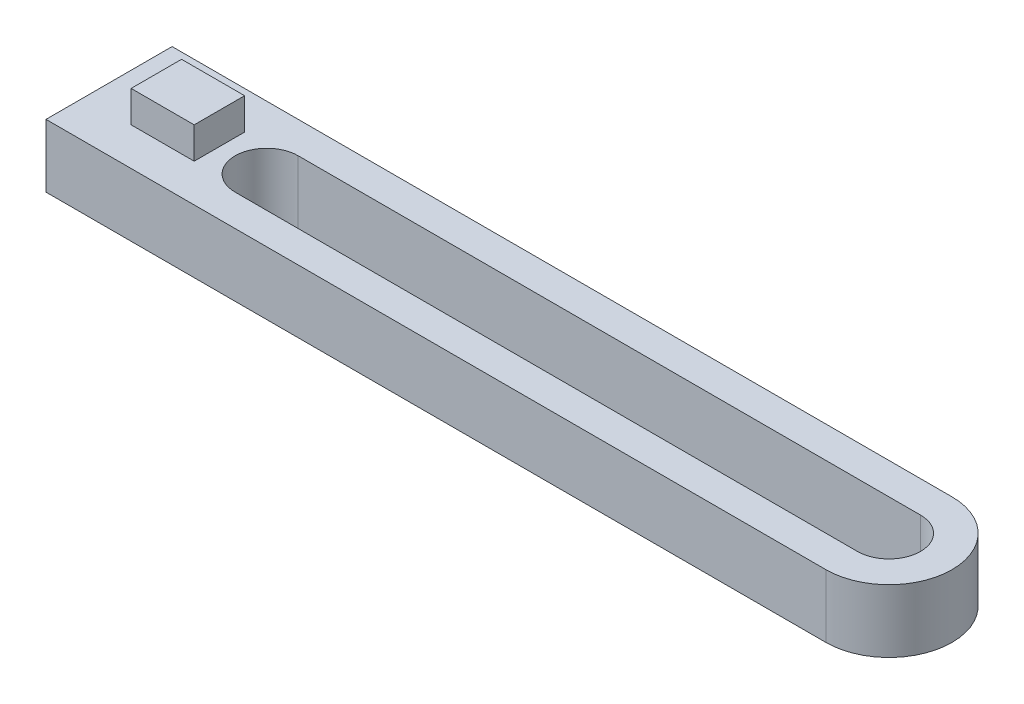
ISO-10303-21;
HEADER;
FILE_DESCRIPTION(('STEP AP214'),'2;1');
FILE_NAME('part.step','',(''),(''),'','','');
FILE_SCHEMA(('AUTOMOTIVE_DESIGN { 1 0 10303 214 1 1 1 1 }'));
ENDSEC;
DATA;
#1=APPLICATION_CONTEXT('core data for automotive mechanical design processes');
#2=APPLICATION_PROTOCOL_DEFINITION('international standard','automotive_design',2000,#1);
#3=PRODUCT_CONTEXT('',#1,'mechanical');
#4=PRODUCT('Part','Part','',(#3));
#5=PRODUCT_RELATED_PRODUCT_CATEGORY('part','',(#4));
#6=PRODUCT_DEFINITION_FORMATION('','',#4);
#7=PRODUCT_DEFINITION_CONTEXT('part definition',#1,'design');
#8=PRODUCT_DEFINITION('design','',#6,#7);
#9=PRODUCT_DEFINITION_SHAPE('','',#8);
#10=(LENGTH_UNIT() NAMED_UNIT(*) SI_UNIT(.MILLI.,.METRE.));
#11=(NAMED_UNIT(*) PLANE_ANGLE_UNIT() SI_UNIT($,.RADIAN.));
#12=(NAMED_UNIT(*) SI_UNIT($,.STERADIAN.) SOLID_ANGLE_UNIT());
#13=UNCERTAINTY_MEASURE_WITH_UNIT(LENGTH_MEASURE(1.E-05),#10,'distance_accuracy_value','');
#14=(GEOMETRIC_REPRESENTATION_CONTEXT(3) GLOBAL_UNCERTAINTY_ASSIGNED_CONTEXT((#13)) GLOBAL_UNIT_ASSIGNED_CONTEXT((#10,
#11,#12)) REPRESENTATION_CONTEXT('',''));
#15=CARTESIAN_POINT('',(0.,0.,0.));
#16=DIRECTION('',(0.,0.,1.));
#17=DIRECTION('',(1.,0.,0.));
#18=AXIS2_PLACEMENT_3D('',#15,#16,#17);
#19=CARTESIAN_POINT('',(0.,0.,0.));
#20=DIRECTION('',(0.,1.,0.));
#21=DIRECTION('',(0.,0.,1.));
#22=AXIS2_PLACEMENT_3D('',#19,#20,#21);
#23=PLANE('',#22);
#24=CARTESIAN_POINT('',(0.,0.,-56.3815572471546));
#25=DIRECTION('',(0.,1.,0.));
#26=DIRECTION('',(0.,0.,1.));
#27=AXIS2_PLACEMENT_3D('',#24,#25,#26);
#28=CIRCLE('',#27,2.);
#29=CARTESIAN_POINT('',(0.,0.,-54.3815572471546));
#30=VERTEX_POINT('',#29);
#31=CARTESIAN_POINT('',(0.,0.,-58.3815572471546));
#32=VERTEX_POINT('',#31);
#33=EDGE_CURVE('E147',#30,#32,#28,.T.);
#34=ORIENTED_EDGE('',*,*,#33,.F.);
#35=DIRECTION('',(1.,0.,0.));
#36=VECTOR('',#35,1.);
#37=CARTESIAN_POINT('',(0.,0.,-54.3815572471546));
#38=LINE('',#37,#36);
#39=CARTESIAN_POINT('',(-39.4787914004602,0.,-54.3815572471546));
#40=VERTEX_POINT('',#39);
#41=EDGE_CURVE('E150',#40,#30,#38,.T.);
#42=ORIENTED_EDGE('',*,*,#41,.F.);
#43=CARTESIAN_POINT('',(-39.4787914004602,0.,-56.3815572471546));
#44=DIRECTION('',(0.,1.,0.));
#45=DIRECTION('',(0.,0.,1.));
#46=AXIS2_PLACEMENT_3D('',#43,#44,#45);
#47=CIRCLE('',#46,2.);
#48=CARTESIAN_POINT('',(-39.4787914004602,0.,-58.3815572471546));
#49=VERTEX_POINT('',#48);
#50=EDGE_CURVE('E179',#40,#49,#47,.F.);
#51=ORIENTED_EDGE('',*,*,#50,.T.);
#52=DIRECTION('',(1.,0.,0.));
#53=VECTOR('',#52,1.);
#54=CARTESIAN_POINT('',(0.,0.,-58.3815572471546));
#55=LINE('',#54,#53);
#56=EDGE_CURVE('E182',#49,#32,#55,.T.);
#57=ORIENTED_EDGE('',*,*,#56,.T.);
#58=EDGE_LOOP('',(#34,#42,#51,#57));
#59=FACE_BOUND('',#58,.T.);
#60=DIRECTION('',(1.,0.,0.));
#61=VECTOR('',#60,1.);
#62=CARTESIAN_POINT('',(0.,0.,-52.3815572471546));
#63=LINE('',#62,#61);
#64=CARTESIAN_POINT('',(-49.4787914004602,0.,-52.3815572471546));
#65=VERTEX_POINT('',#64);
#66=CARTESIAN_POINT('',(0.,0.,-52.3815572471546));
#67=VERTEX_POINT('',#66);
#68=EDGE_CURVE('E185',#65,#67,#63,.T.);
#69=ORIENTED_EDGE('',*,*,#68,.T.);
#70=CARTESIAN_POINT('',(0.,0.,-56.3815572471546));
#71=DIRECTION('',(0.,1.,0.));
#72=DIRECTION('',(0.,0.,1.));
#73=AXIS2_PLACEMENT_3D('',#70,#71,#72);
#74=CIRCLE('',#73,4.);
#75=CARTESIAN_POINT('',(0.,0.,-60.3815572471546));
#76=VERTEX_POINT('',#75);
#77=EDGE_CURVE('E188',#67,#76,#74,.T.);
#78=ORIENTED_EDGE('',*,*,#77,.T.);
#79=DIRECTION('',(1.,0.,0.));
#80=VECTOR('',#79,1.);
#81=CARTESIAN_POINT('',(0.,0.,-60.3815572471546));
#82=LINE('',#81,#80);
#83=CARTESIAN_POINT('',(-49.4787914004602,0.,-60.3815572471546));
#84=VERTEX_POINT('',#83);
#85=EDGE_CURVE('E191',#84,#76,#82,.T.);
#86=ORIENTED_EDGE('',*,*,#85,.F.);
#87=DIRECTION('',(0.,0.,1.));
#88=VECTOR('',#87,1.);
#89=CARTESIAN_POINT('',(-49.4787914004602,0.,0.));
#90=LINE('',#89,#88);
#91=EDGE_CURVE('E159',#84,#65,#90,.T.);
#92=ORIENTED_EDGE('',*,*,#91,.T.);
#93=EDGE_LOOP('',(#69,#78,#86,#92));
#94=FACE_BOUND('',#93,.T.);
#95=DIRECTION('',(0.,0.,-1.));
#96=VECTOR('',#95,1.);
#97=CARTESIAN_POINT('',(-42.4787914004602,0.,0.));
#98=LINE('',#97,#96);
#99=CARTESIAN_POINT('',(-42.4787914004602,0.,-54.7815572471546));
#100=VERTEX_POINT('',#99);
#101=CARTESIAN_POINT('',(-42.4787914004602,0.,-57.9815572471546));
#102=VERTEX_POINT('',#101);
#103=EDGE_CURVE('E52',#100,#102,#98,.T.);
#104=ORIENTED_EDGE('',*,*,#103,.F.);
#105=DIRECTION('',(1.,0.,0.));
#106=VECTOR('',#105,1.);
#107=CARTESIAN_POINT('',(0.,0.,-54.7815572471547));
#108=LINE('',#107,#106);
#109=CARTESIAN_POINT('',(-46.4787914004602,0.,-54.7815572471546));
#110=VERTEX_POINT('',#109);
#111=EDGE_CURVE('E146',#110,#100,#108,.T.);
#112=ORIENTED_EDGE('',*,*,#111,.F.);
#113=DIRECTION('',(0.,0.,-1.));
#114=VECTOR('',#113,1.);
#115=CARTESIAN_POINT('',(-46.4787914004604,0.,-1.00784813221759E-13));
#116=LINE('',#115,#114);
#117=CARTESIAN_POINT('',(-46.4787914004602,0.,-57.9815572471546));
#118=VERTEX_POINT('',#117);
#119=EDGE_CURVE('E143',#110,#118,#116,.T.);
#120=ORIENTED_EDGE('',*,*,#119,.T.);
#121=DIRECTION('',(1.,0.,0.));
#122=VECTOR('',#121,1.);
#123=CARTESIAN_POINT('',(0.,0.,-57.9815572471546));
#124=LINE('',#123,#122);
#125=EDGE_CURVE('E57',#118,#102,#124,.T.);
#126=ORIENTED_EDGE('',*,*,#125,.T.);
#127=EDGE_LOOP('',(#104,#112,#120,#126));
#128=FACE_BOUND('',#127,.T.);
#129=ADVANCED_FACE('F35',(#59,#94,#128),#23,.T.);
#130=CARTESIAN_POINT('',(0.,-4.,-52.3815572471546));
#131=DIRECTION('',(0.,0.,1.));
#132=DIRECTION('',(1.,0.,0.));
#133=AXIS2_PLACEMENT_3D('',#130,#131,#132);
#134=PLANE('',#133);
#135=ORIENTED_EDGE('',*,*,#68,.F.);
#136=DIRECTION('',(0.,1.,0.));
#137=VECTOR('',#136,1.);
#138=CARTESIAN_POINT('',(-49.4787914004602,-4.,-52.3815572471546));
#139=LINE('',#138,#137);
#140=CARTESIAN_POINT('',(-49.4787914004602,-4.,-52.3815572471546));
#141=VERTEX_POINT('',#140);
#142=EDGE_CURVE('E11',#141,#65,#139,.T.);
#143=ORIENTED_EDGE('',*,*,#142,.F.);
#144=DIRECTION('',(1.,0.,0.));
#145=VECTOR('',#144,1.);
#146=CARTESIAN_POINT('',(0.,-4.,-52.3815572471546));
#147=LINE('',#146,#145);
#148=CARTESIAN_POINT('',(0.,-4.,-52.3815572471546));
#149=VERTEX_POINT('',#148);
#150=EDGE_CURVE('E167',#141,#149,#147,.T.);
#151=ORIENTED_EDGE('',*,*,#150,.T.);
#152=DIRECTION('',(0.,1.,0.));
#153=VECTOR('',#152,1.);
#154=CARTESIAN_POINT('',(0.,-4.,-52.3815572471546));
#155=LINE('',#154,#153);
#156=EDGE_CURVE('E199',#149,#67,#155,.T.);
#157=ORIENTED_EDGE('',*,*,#156,.T.);
#158=EDGE_LOOP('',(#135,#143,#151,#157));
#159=FACE_BOUND('',#158,.T.);
#160=ADVANCED_FACE('F238',(#159),#134,.T.);
#161=CARTESIAN_POINT('',(-49.4787914004602,-4.,0.));
#162=DIRECTION('',(-1.,0.,0.));
#163=DIRECTION('',(0.,0.,1.));
#164=AXIS2_PLACEMENT_3D('',#161,#162,#163);
#165=PLANE('',#164);
#166=ORIENTED_EDGE('',*,*,#91,.F.);
#167=DIRECTION('',(0.,1.,0.));
#168=VECTOR('',#167,1.);
#169=CARTESIAN_POINT('',(-49.4787914004602,-4.,-60.3815572471546));
#170=LINE('',#169,#168);
#171=CARTESIAN_POINT('',(-49.4787914004602,-4.,-60.3815572471546));
#172=VERTEX_POINT('',#171);
#173=EDGE_CURVE('E44',#172,#84,#170,.T.);
#174=ORIENTED_EDGE('',*,*,#173,.F.);
#175=DIRECTION('',(0.,0.,1.));
#176=VECTOR('',#175,1.);
#177=CARTESIAN_POINT('',(-49.4787914004602,-4.,0.));
#178=LINE('',#177,#176);
#179=EDGE_CURVE('E175',#172,#141,#178,.T.);
#180=ORIENTED_EDGE('',*,*,#179,.T.);
#181=ORIENTED_EDGE('',*,*,#142,.T.);
#182=EDGE_LOOP('',(#166,#174,#180,#181));
#183=FACE_BOUND('',#182,.T.);
#184=ADVANCED_FACE('F243',(#183),#165,.T.);
#185=CARTESIAN_POINT('',(0.,-4.,-60.3815572471546));
#186=DIRECTION('',(0.,0.,1.));
#187=DIRECTION('',(1.,0.,0.));
#188=AXIS2_PLACEMENT_3D('',#185,#186,#187);
#189=PLANE('',#188);
#190=ORIENTED_EDGE('',*,*,#85,.T.);
#191=DIRECTION('',(0.,1.,0.));
#192=VECTOR('',#191,1.);
#193=CARTESIAN_POINT('',(0.,-4.,-60.3815572471546));
#194=LINE('',#193,#192);
#195=CARTESIAN_POINT('',(0.,-4.,-60.3815572471546));
#196=VERTEX_POINT('',#195);
#197=EDGE_CURVE('E197',#196,#76,#194,.T.);
#198=ORIENTED_EDGE('',*,*,#197,.F.);
#199=DIRECTION('',(1.,0.,0.));
#200=VECTOR('',#199,1.);
#201=CARTESIAN_POINT('',(0.,-4.,-60.3815572471546));
#202=LINE('',#201,#200);
#203=EDGE_CURVE('E173',#172,#196,#202,.T.);
#204=ORIENTED_EDGE('',*,*,#203,.F.);
#205=ORIENTED_EDGE('',*,*,#173,.T.);
#206=EDGE_LOOP('',(#190,#198,#204,#205));
#207=FACE_BOUND('',#206,.T.);
#208=ADVANCED_FACE('F251',(#207),#189,.F.);
#209=CARTESIAN_POINT('',(0.,-4.,-56.3815572471546));
#210=DIRECTION('',(0.,1.,0.));
#211=DIRECTION('',(0.,0.,1.));
#212=AXIS2_PLACEMENT_3D('',#209,#210,#211);
#213=CYLINDRICAL_SURFACE('',#212,2.);
#214=ORIENTED_EDGE('',*,*,#33,.T.);
#215=DIRECTION('',(0.,1.,0.));
#216=VECTOR('',#215,1.);
#217=CARTESIAN_POINT('',(0.,-4.,-58.3815572471546));
#218=LINE('',#217,#216);
#219=CARTESIAN_POINT('',(0.,-4.,-58.3815572471546));
#220=VERTEX_POINT('',#219);
#221=EDGE_CURVE('E201',#220,#32,#218,.T.);
#222=ORIENTED_EDGE('',*,*,#221,.F.);
#223=CARTESIAN_POINT('',(0.,-4.,-56.3815572471546));
#224=DIRECTION('',(0.,1.,0.));
#225=DIRECTION('',(0.,0.,1.));
#226=AXIS2_PLACEMENT_3D('',#223,#224,#225);
#227=CIRCLE('',#226,2.);
#228=CARTESIAN_POINT('',(0.,-4.,-54.3815572471546));
#229=VERTEX_POINT('',#228);
#230=EDGE_CURVE('E156',#229,#220,#227,.T.);
#231=ORIENTED_EDGE('',*,*,#230,.F.);
#232=DIRECTION('',(0.,1.,0.));
#233=VECTOR('',#232,1.);
#234=CARTESIAN_POINT('',(0.,-4.,-54.3815572471546));
#235=LINE('',#234,#233);
#236=EDGE_CURVE('E39',#229,#30,#235,.T.);
#237=ORIENTED_EDGE('',*,*,#236,.T.);
#238=EDGE_LOOP('',(#214,#222,#231,#237));
#239=FACE_BOUND('',#238,.T.);
#240=ADVANCED_FACE('F37',(#239),#213,.F.);
#241=CARTESIAN_POINT('',(0.,-4.,-58.3815572471546));
#242=DIRECTION('',(0.,0.,1.));
#243=DIRECTION('',(1.,0.,0.));
#244=AXIS2_PLACEMENT_3D('',#241,#242,#243);
#245=PLANE('',#244);
#246=ORIENTED_EDGE('',*,*,#56,.F.);
#247=DIRECTION('',(0.,1.,0.));
#248=VECTOR('',#247,1.);
#249=CARTESIAN_POINT('',(-39.4787914004602,-4.,-58.3815572471546));
#250=LINE('',#249,#248);
#251=CARTESIAN_POINT('',(-39.4787914004602,-4.,-58.3815572471546));
#252=VERTEX_POINT('',#251);
#253=EDGE_CURVE('E203',#252,#49,#250,.T.);
#254=ORIENTED_EDGE('',*,*,#253,.F.);
#255=DIRECTION('',(1.,0.,0.));
#256=VECTOR('',#255,1.);
#257=CARTESIAN_POINT('',(0.,-4.,-58.3815572471546));
#258=LINE('',#257,#256);
#259=EDGE_CURVE('E164',#252,#220,#258,.T.);
#260=ORIENTED_EDGE('',*,*,#259,.T.);
#261=ORIENTED_EDGE('',*,*,#221,.T.);
#262=EDGE_LOOP('',(#246,#254,#260,#261));
#263=FACE_BOUND('',#262,.T.);
#264=ADVANCED_FACE('F219',(#263),#245,.T.);
#265=CARTESIAN_POINT('',(-39.4787914004602,-4.,-56.3815572471546));
#266=DIRECTION('',(0.,1.,0.));
#267=DIRECTION('',(0.,0.,1.));
#268=AXIS2_PLACEMENT_3D('',#265,#266,#267);
#269=CYLINDRICAL_SURFACE('',#268,2.);
#270=ORIENTED_EDGE('',*,*,#50,.F.);
#271=DIRECTION('',(0.,1.,0.));
#272=VECTOR('',#271,1.);
#273=CARTESIAN_POINT('',(-39.4787914004602,-4.,-54.3815572471546));
#274=LINE('',#273,#272);
#275=CARTESIAN_POINT('',(-39.4787914004602,-4.,-54.3815572471546));
#276=VERTEX_POINT('',#275);
#277=EDGE_CURVE('E204',#276,#40,#274,.T.);
#278=ORIENTED_EDGE('',*,*,#277,.F.);
#279=CARTESIAN_POINT('',(-39.4787914004602,-4.,-56.3815572471546));
#280=DIRECTION('',(0.,1.,0.));
#281=DIRECTION('',(0.,0.,1.));
#282=AXIS2_PLACEMENT_3D('',#279,#280,#281);
#283=CIRCLE('',#282,2.);
#284=EDGE_CURVE('E161',#276,#252,#283,.F.);
#285=ORIENTED_EDGE('',*,*,#284,.T.);
#286=ORIENTED_EDGE('',*,*,#253,.T.);
#287=EDGE_LOOP('',(#270,#278,#285,#286));
#288=FACE_BOUND('',#287,.T.);
#289=ADVANCED_FACE('F228',(#288),#269,.F.);
#290=CARTESIAN_POINT('',(0.,-4.,-54.3815572471546));
#291=DIRECTION('',(0.,0.,1.));
#292=DIRECTION('',(1.,0.,0.));
#293=AXIS2_PLACEMENT_3D('',#290,#291,#292);
#294=PLANE('',#293);
#295=ORIENTED_EDGE('',*,*,#41,.T.);
#296=ORIENTED_EDGE('',*,*,#236,.F.);
#297=DIRECTION('',(1.,0.,0.));
#298=VECTOR('',#297,1.);
#299=CARTESIAN_POINT('',(0.,-4.,-54.3815572471546));
#300=LINE('',#299,#298);
#301=EDGE_CURVE('E158',#276,#229,#300,.T.);
#302=ORIENTED_EDGE('',*,*,#301,.F.);
#303=ORIENTED_EDGE('',*,*,#277,.T.);
#304=EDGE_LOOP('',(#295,#296,#302,#303));
#305=FACE_BOUND('',#304,.T.);
#306=ADVANCED_FACE('F225',(#305),#294,.F.);
#307=CARTESIAN_POINT('',(0.,-4.,-56.3815572471546));
#308=DIRECTION('',(0.,1.,0.));
#309=DIRECTION('',(0.,0.,1.));
#310=AXIS2_PLACEMENT_3D('',#307,#308,#309);
#311=CYLINDRICAL_SURFACE('',#310,4.);
#312=ORIENTED_EDGE('',*,*,#77,.F.);
#313=ORIENTED_EDGE('',*,*,#156,.F.);
#314=CARTESIAN_POINT('',(0.,-4.,-56.3815572471546));
#315=DIRECTION('',(0.,1.,0.));
#316=DIRECTION('',(0.,0.,1.));
#317=AXIS2_PLACEMENT_3D('',#314,#315,#316);
#318=CIRCLE('',#317,4.);
#319=EDGE_CURVE('E170',#149,#196,#318,.T.);
#320=ORIENTED_EDGE('',*,*,#319,.T.);
#321=ORIENTED_EDGE('',*,*,#197,.T.);
#322=EDGE_LOOP('',(#312,#313,#320,#321));
#323=FACE_BOUND('',#322,.T.);
#324=ADVANCED_FACE('F227',(#323),#311,.T.);
#325=CARTESIAN_POINT('',(0.,-4.,0.));
#326=DIRECTION('',(0.,1.,0.));
#327=DIRECTION('',(0.,0.,1.));
#328=AXIS2_PLACEMENT_3D('',#325,#326,#327);
#329=PLANE('',#328);
#330=ORIENTED_EDGE('',*,*,#230,.T.);
#331=ORIENTED_EDGE('',*,*,#259,.F.);
#332=ORIENTED_EDGE('',*,*,#284,.F.);
#333=ORIENTED_EDGE('',*,*,#301,.T.);
#334=EDGE_LOOP('',(#330,#331,#332,#333));
#335=FACE_BOUND('',#334,.T.);
#336=ORIENTED_EDGE('',*,*,#150,.F.);
#337=ORIENTED_EDGE('',*,*,#179,.F.);
#338=ORIENTED_EDGE('',*,*,#203,.T.);
#339=ORIENTED_EDGE('',*,*,#319,.F.);
#340=EDGE_LOOP('',(#336,#337,#338,#339));
#341=FACE_BOUND('',#340,.T.);
#342=ADVANCED_FACE('F223',(#335,#341),#329,.F.);
#343=CARTESIAN_POINT('',(0.,2.,-54.7815572471547));
#344=DIRECTION('',(0.,0.,-1.));
#345=DIRECTION('',(-1.,0.,0.));
#346=AXIS2_PLACEMENT_3D('',#343,#344,#345);
#347=PLANE('',#346);
#348=ORIENTED_EDGE('',*,*,#111,.T.);
#349=DIRECTION('',(0.,-1.,0.));
#350=VECTOR('',#349,1.);
#351=CARTESIAN_POINT('',(-42.4787914004602,2.,-54.7815572471546));
#352=LINE('',#351,#350);
#353=CARTESIAN_POINT('',(-42.4787914004602,2.,-54.7815572471546));
#354=VERTEX_POINT('',#353);
#355=EDGE_CURVE('E127',#354,#100,#352,.T.);
#356=ORIENTED_EDGE('',*,*,#355,.F.);
#357=DIRECTION('',(1.,0.,0.));
#358=VECTOR('',#357,1.);
#359=CARTESIAN_POINT('',(0.,2.,-54.7815572471547));
#360=LINE('',#359,#358);
#361=CARTESIAN_POINT('',(-46.4787914004602,2.,-54.7815572471546));
#362=VERTEX_POINT('',#361);
#363=EDGE_CURVE('E134',#362,#354,#360,.T.);
#364=ORIENTED_EDGE('',*,*,#363,.F.);
#365=DIRECTION('',(0.,-1.,0.));
#366=VECTOR('',#365,1.);
#367=CARTESIAN_POINT('',(-46.4787914004602,2.,-54.7815572471546));
#368=LINE('',#367,#366);
#369=EDGE_CURVE('E355',#362,#110,#368,.T.);
#370=ORIENTED_EDGE('',*,*,#369,.T.);
#371=EDGE_LOOP('',(#348,#356,#364,#370));
#372=FACE_BOUND('',#371,.T.);
#373=ADVANCED_FACE('F145',(#372),#347,.F.);
#374=CARTESIAN_POINT('',(-42.4787914004602,2.,0.));
#375=DIRECTION('',(-1.,0.,0.));
#376=DIRECTION('',(0.,0.,1.));
#377=AXIS2_PLACEMENT_3D('',#374,#375,#376);
#378=PLANE('',#377);
#379=ORIENTED_EDGE('',*,*,#103,.T.);
#380=DIRECTION('',(0.,-1.,0.));
#381=VECTOR('',#380,1.);
#382=CARTESIAN_POINT('',(-42.4787914004602,2.,-57.9815572471546));
#383=LINE('',#382,#381);
#384=CARTESIAN_POINT('',(-42.4787914004602,2.,-57.9815572471546));
#385=VERTEX_POINT('',#384);
#386=EDGE_CURVE('E129',#385,#102,#383,.T.);
#387=ORIENTED_EDGE('',*,*,#386,.F.);
#388=DIRECTION('',(0.,0.,-1.));
#389=VECTOR('',#388,1.);
#390=CARTESIAN_POINT('',(-42.4787914004602,2.,0.));
#391=LINE('',#390,#389);
#392=EDGE_CURVE('E123',#354,#385,#391,.T.);
#393=ORIENTED_EDGE('',*,*,#392,.F.);
#394=ORIENTED_EDGE('',*,*,#355,.T.);
#395=EDGE_LOOP('',(#379,#387,#393,#394));
#396=FACE_BOUND('',#395,.T.);
#397=ADVANCED_FACE('F125',(#396),#378,.F.);
#398=CARTESIAN_POINT('',(0.,2.,-57.9815572471546));
#399=DIRECTION('',(0.,0.,-1.));
#400=DIRECTION('',(-1.,0.,0.));
#401=AXIS2_PLACEMENT_3D('',#398,#399,#400);
#402=PLANE('',#401);
#403=ORIENTED_EDGE('',*,*,#125,.F.);
#404=DIRECTION('',(0.,-1.,0.));
#405=VECTOR('',#404,1.);
#406=CARTESIAN_POINT('',(-46.4787914004602,2.,-57.9815572471546));
#407=LINE('',#406,#405);
#408=CARTESIAN_POINT('',(-46.4787914004602,2.,-57.9815572471546));
#409=VERTEX_POINT('',#408);
#410=EDGE_CURVE('E152',#409,#118,#407,.T.);
#411=ORIENTED_EDGE('',*,*,#410,.F.);
#412=DIRECTION('',(1.,0.,0.));
#413=VECTOR('',#412,1.);
#414=CARTESIAN_POINT('',(0.,2.,-57.9815572471546));
#415=LINE('',#414,#413);
#416=EDGE_CURVE('E133',#409,#385,#415,.T.);
#417=ORIENTED_EDGE('',*,*,#416,.T.);
#418=ORIENTED_EDGE('',*,*,#386,.T.);
#419=EDGE_LOOP('',(#403,#411,#417,#418));
#420=FACE_BOUND('',#419,.T.);
#421=ADVANCED_FACE('F323',(#420),#402,.T.);
#422=CARTESIAN_POINT('',(-46.4787914004604,2.,-1.00784813221759E-13));
#423=DIRECTION('',(-1.,0.,0.));
#424=DIRECTION('',(0.,0.,1.));
#425=AXIS2_PLACEMENT_3D('',#422,#423,#424);
#426=PLANE('',#425);
#427=ORIENTED_EDGE('',*,*,#119,.F.);
#428=ORIENTED_EDGE('',*,*,#369,.F.);
#429=DIRECTION('',(0.,0.,-1.));
#430=VECTOR('',#429,1.);
#431=CARTESIAN_POINT('',(-46.4787914004604,2.,-1.00784813221759E-13));
#432=LINE('',#431,#430);
#433=EDGE_CURVE('E140',#362,#409,#432,.T.);
#434=ORIENTED_EDGE('',*,*,#433,.T.);
#435=ORIENTED_EDGE('',*,*,#410,.T.);
#436=EDGE_LOOP('',(#427,#428,#434,#435));
#437=FACE_BOUND('',#436,.T.);
#438=ADVANCED_FACE('F332',(#437),#426,.T.);
#439=CARTESIAN_POINT('',(0.,2.,0.));
#440=DIRECTION('',(0.,1.,0.));
#441=DIRECTION('',(0.,0.,1.));
#442=AXIS2_PLACEMENT_3D('',#439,#440,#441);
#443=PLANE('',#442);
#444=ORIENTED_EDGE('',*,*,#363,.T.);
#445=ORIENTED_EDGE('',*,*,#392,.T.);
#446=ORIENTED_EDGE('',*,*,#416,.F.);
#447=ORIENTED_EDGE('',*,*,#433,.F.);
#448=EDGE_LOOP('',(#444,#445,#446,#447));
#449=FACE_BOUND('',#448,.T.);
#450=ADVANCED_FACE('F138',(#449),#443,.T.);
#451=CLOSED_SHELL('',(#129,#160,#184,#208,#240,#264,#289,#306,#324,#342,#373,#397,#421,#438,#450));
#452=MANIFOLD_SOLID_BREP('B2',#451);
#453=ADVANCED_BREP_SHAPE_REPRESENTATION('',(#18,#452),#14);
#454=SHAPE_DEFINITION_REPRESENTATION(#9,#453);
ENDSEC;
END-ISO-10303-21;
